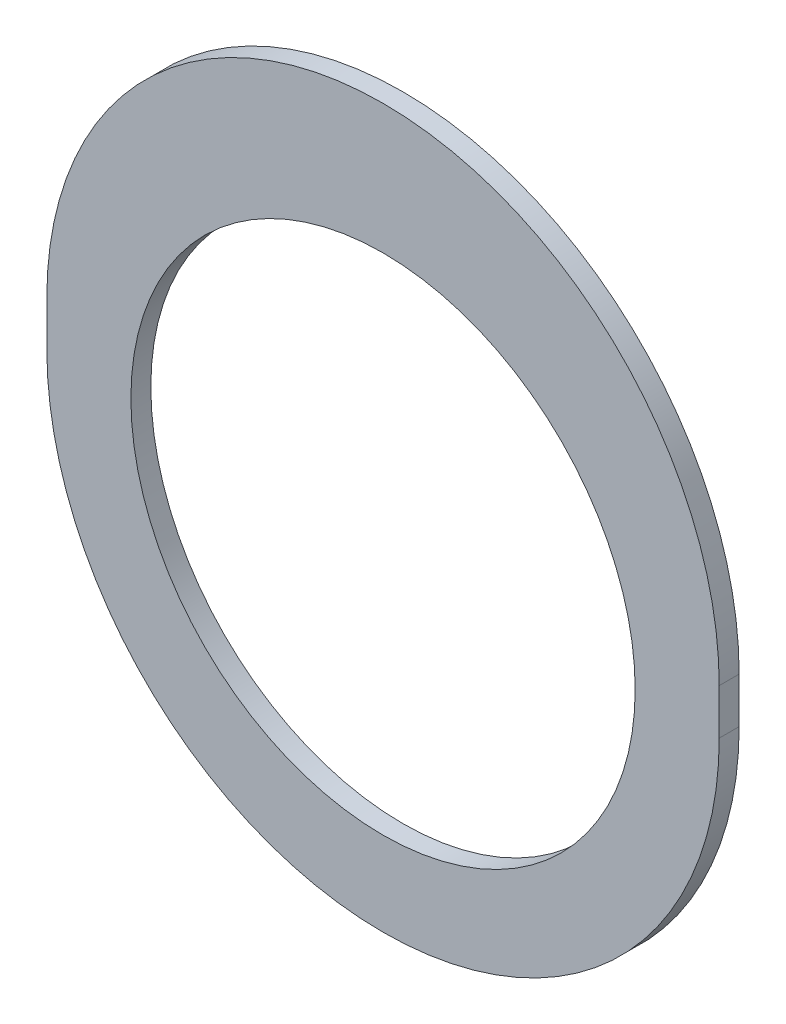
ISO-10303-21;
HEADER;
FILE_DESCRIPTION(('STEP AP214'),'2;1');
FILE_NAME('part.step','',(''),(''),'','','');
FILE_SCHEMA(('AUTOMOTIVE_DESIGN { 1 0 10303 214 1 1 1 1 }'));
ENDSEC;
DATA;
#1=APPLICATION_CONTEXT('core data for automotive mechanical design processes');
#2=APPLICATION_PROTOCOL_DEFINITION('international standard','automotive_design',2000,#1);
#3=PRODUCT_CONTEXT('',#1,'mechanical');
#4=PRODUCT('Part','Part','',(#3));
#5=PRODUCT_RELATED_PRODUCT_CATEGORY('part','',(#4));
#6=PRODUCT_DEFINITION_FORMATION('','',#4);
#7=PRODUCT_DEFINITION_CONTEXT('part definition',#1,'design');
#8=PRODUCT_DEFINITION('design','',#6,#7);
#9=PRODUCT_DEFINITION_SHAPE('','',#8);
#10=(LENGTH_UNIT() NAMED_UNIT(*) SI_UNIT(.MILLI.,.METRE.));
#11=(NAMED_UNIT(*) PLANE_ANGLE_UNIT() SI_UNIT($,.RADIAN.));
#12=(NAMED_UNIT(*) SI_UNIT($,.STERADIAN.) SOLID_ANGLE_UNIT());
#13=UNCERTAINTY_MEASURE_WITH_UNIT(LENGTH_MEASURE(1.E-05),#10,'distance_accuracy_value','');
#14=(GEOMETRIC_REPRESENTATION_CONTEXT(3) GLOBAL_UNCERTAINTY_ASSIGNED_CONTEXT((#13)) GLOBAL_UNIT_ASSIGNED_CONTEXT((#10,
#11,#12)) REPRESENTATION_CONTEXT('',''));
#15=CARTESIAN_POINT('',(0.,0.,0.));
#16=DIRECTION('',(0.,0.,1.));
#17=DIRECTION('',(1.,0.,0.));
#18=AXIS2_PLACEMENT_3D('',#15,#16,#17);
#19=CARTESIAN_POINT('',(94.4310024,117.0280108,0.));
#20=DIRECTION('',(-1.,0.,0.));
#21=DIRECTION('',(0.,1.,0.));
#22=AXIS2_PLACEMENT_3D('',#19,#20,#21);
#23=PLANE('',#22);
#24=DIRECTION('',(0.,1.,0.));
#25=VECTOR('',#24,1.);
#26=CARTESIAN_POINT('',(94.4310024,117.0280108,0.03556));
#27=LINE('',#26,#25);
#28=CARTESIAN_POINT('',(94.4310024,117.0280108,0.03556));
#29=VERTEX_POINT('',#28);
#30=CARTESIAN_POINT('',(94.4310024,117.1091892,0.03556));
#31=VERTEX_POINT('',#30);
#32=EDGE_CURVE('E11',#29,#31,#27,.T.);
#33=ORIENTED_EDGE('',*,*,#32,.F.);
#34=DIRECTION('',(0.,0.,1.));
#35=VECTOR('',#34,1.);
#36=CARTESIAN_POINT('',(94.4310024,117.0280108,0.));
#37=LINE('',#36,#35);
#38=CARTESIAN_POINT('',(94.4310024,117.0280108,0.));
#39=VERTEX_POINT('',#38);
#40=EDGE_CURVE('E24',#39,#29,#37,.T.);
#41=ORIENTED_EDGE('',*,*,#40,.F.);
#42=DIRECTION('',(0.,1.,0.));
#43=VECTOR('',#42,1.);
#44=CARTESIAN_POINT('',(94.4310024,117.0280108,0.));
#45=LINE('',#44,#43);
#46=CARTESIAN_POINT('',(94.4310024,117.1091892,0.));
#47=VERTEX_POINT('',#46);
#48=EDGE_CURVE('E96',#39,#47,#45,.T.);
#49=ORIENTED_EDGE('',*,*,#48,.T.);
#50=DIRECTION('',(0.,0.,1.));
#51=VECTOR('',#50,1.);
#52=CARTESIAN_POINT('',(94.4310024,117.1091892,0.));
#53=LINE('',#52,#51);
#54=EDGE_CURVE('E37',#47,#31,#53,.T.);
#55=ORIENTED_EDGE('',*,*,#54,.T.);
#56=EDGE_LOOP('',(#33,#41,#49,#55));
#57=FACE_BOUND('',#56,.T.);
#58=ADVANCED_FACE('F17',(#57),#23,.F.);
#59=CARTESIAN_POINT('',(93.8310036,117.0280108,0.));
#60=DIRECTION('',(0.,0.,-1.));
#61=DIRECTION('',(-1.,0.,0.));
#62=AXIS2_PLACEMENT_3D('',#59,#60,#61);
#63=CYLINDRICAL_SURFACE('',#62,0.599998799999999);
#64=CARTESIAN_POINT('',(93.8310036,117.0280108,0.03556));
#65=DIRECTION('',(0.,0.,1.));
#66=DIRECTION('',(-1.,0.,0.));
#67=AXIS2_PLACEMENT_3D('',#64,#65,#66);
#68=CIRCLE('',#67,0.599998799999999);
#69=CARTESIAN_POINT('',(93.2310048,117.0280108,0.03556));
#70=VERTEX_POINT('',#69);
#71=EDGE_CURVE('E92',#70,#29,#68,.T.);
#72=ORIENTED_EDGE('',*,*,#71,.F.);
#73=DIRECTION('',(0.,0.,1.));
#74=VECTOR('',#73,1.);
#75=CARTESIAN_POINT('',(93.2310048,117.0280108,0.));
#76=LINE('',#75,#74);
#77=CARTESIAN_POINT('',(93.2310048,117.0280108,0.));
#78=VERTEX_POINT('',#77);
#79=EDGE_CURVE('E90',#78,#70,#76,.T.);
#80=ORIENTED_EDGE('',*,*,#79,.F.);
#81=CARTESIAN_POINT('',(93.8310036,117.0280108,0.));
#82=DIRECTION('',(0.,0.,1.));
#83=DIRECTION('',(-1.,0.,0.));
#84=AXIS2_PLACEMENT_3D('',#81,#82,#83);
#85=CIRCLE('',#84,0.599998799999999);
#86=EDGE_CURVE('E88',#78,#39,#85,.T.);
#87=ORIENTED_EDGE('',*,*,#86,.T.);
#88=ORIENTED_EDGE('',*,*,#40,.T.);
#89=EDGE_LOOP('',(#72,#80,#87,#88));
#90=FACE_BOUND('',#89,.T.);
#91=ADVANCED_FACE('F111',(#90),#63,.T.);
#92=CARTESIAN_POINT('',(93.8310036,117.1091892,0.));
#93=DIRECTION('',(0.,0.,-1.));
#94=DIRECTION('',(1.,0.,0.));
#95=AXIS2_PLACEMENT_3D('',#92,#93,#94);
#96=CYLINDRICAL_SURFACE('',#95,0.599998799999999);
#97=CARTESIAN_POINT('',(93.8310036,117.1091892,0.03556));
#98=DIRECTION('',(0.,0.,1.));
#99=DIRECTION('',(1.,0.,0.));
#100=AXIS2_PLACEMENT_3D('',#97,#98,#99);
#101=CIRCLE('',#100,0.599998799999999);
#102=CARTESIAN_POINT('',(93.2310048,117.1091892,0.03556));
#103=VERTEX_POINT('',#102);
#104=EDGE_CURVE('E85',#31,#103,#101,.T.);
#105=ORIENTED_EDGE('',*,*,#104,.F.);
#106=ORIENTED_EDGE('',*,*,#54,.F.);
#107=CARTESIAN_POINT('',(93.8310036,117.1091892,0.));
#108=DIRECTION('',(0.,0.,1.));
#109=DIRECTION('',(1.,0.,0.));
#110=AXIS2_PLACEMENT_3D('',#107,#108,#109);
#111=CIRCLE('',#110,0.599998799999999);
#112=CARTESIAN_POINT('',(93.2310048,117.1091892,0.));
#113=VERTEX_POINT('',#112);
#114=EDGE_CURVE('E82',#47,#113,#111,.T.);
#115=ORIENTED_EDGE('',*,*,#114,.T.);
#116=DIRECTION('',(0.,0.,1.));
#117=VECTOR('',#116,1.);
#118=CARTESIAN_POINT('',(93.2310048,117.1091892,0.));
#119=LINE('',#118,#117);
#120=EDGE_CURVE('E80',#113,#103,#119,.T.);
#121=ORIENTED_EDGE('',*,*,#120,.T.);
#122=EDGE_LOOP('',(#105,#106,#115,#121));
#123=FACE_BOUND('',#122,.T.);
#124=ADVANCED_FACE('F104',(#123),#96,.T.);
#125=CARTESIAN_POINT('',(93.2310048,117.1091892,0.));
#126=DIRECTION('',(1.,0.,0.));
#127=DIRECTION('',(0.,-1.,0.));
#128=AXIS2_PLACEMENT_3D('',#125,#126,#127);
#129=PLANE('',#128);
#130=DIRECTION('',(0.,-1.,0.));
#131=VECTOR('',#130,1.);
#132=CARTESIAN_POINT('',(93.2310048,117.1091892,0.03556));
#133=LINE('',#132,#131);
#134=EDGE_CURVE('E77',#103,#70,#133,.T.);
#135=ORIENTED_EDGE('',*,*,#134,.F.);
#136=ORIENTED_EDGE('',*,*,#120,.F.);
#137=DIRECTION('',(0.,-1.,0.));
#138=VECTOR('',#137,1.);
#139=CARTESIAN_POINT('',(93.2310048,117.1091892,0.));
#140=LINE('',#139,#138);
#141=EDGE_CURVE('E68',#113,#78,#140,.T.);
#142=ORIENTED_EDGE('',*,*,#141,.T.);
#143=ORIENTED_EDGE('',*,*,#79,.T.);
#144=EDGE_LOOP('',(#135,#136,#142,#143));
#145=FACE_BOUND('',#144,.T.);
#146=ADVANCED_FACE('F110',(#145),#129,.F.);
#147=CARTESIAN_POINT('',(93.8310036,117.0280108,0.));
#148=DIRECTION('',(0.,0.,-1.));
#149=DIRECTION('',(1.,0.,0.));
#150=AXIS2_PLACEMENT_3D('',#147,#148,#149);
#151=CYLINDRICAL_SURFACE('',#150,0.4499991);
#152=DIRECTION('',(0.,0.,1.));
#153=VECTOR('',#152,1.);
#154=CARTESIAN_POINT('',(94.2810027,117.0280108,0.));
#155=LINE('',#154,#153);
#156=CARTESIAN_POINT('',(94.2810027,117.0280108,0.));
#157=VERTEX_POINT('',#156);
#158=CARTESIAN_POINT('',(94.2810027,117.0280108,0.03556));
#159=VERTEX_POINT('',#158);
#160=EDGE_CURVE('E62',#157,#159,#155,.T.);
#161=ORIENTED_EDGE('',*,*,#160,.T.);
#162=CARTESIAN_POINT('',(93.8310036,117.0280108,0.03556));
#163=DIRECTION('',(0.,0.,1.));
#164=DIRECTION('',(1.,0.,0.));
#165=AXIS2_PLACEMENT_3D('',#162,#163,#164);
#166=CIRCLE('',#165,0.4499991);
#167=EDGE_CURVE('E67',#159,#159,#166,.T.);
#168=ORIENTED_EDGE('',*,*,#167,.T.);
#169=ORIENTED_EDGE('',*,*,#160,.F.);
#170=CARTESIAN_POINT('',(93.8310036,117.0280108,0.));
#171=DIRECTION('',(0.,0.,1.));
#172=DIRECTION('',(1.,0.,0.));
#173=AXIS2_PLACEMENT_3D('',#170,#171,#172);
#174=CIRCLE('',#173,0.4499991);
#175=EDGE_CURVE('E65',#157,#157,#174,.T.);
#176=ORIENTED_EDGE('',*,*,#175,.F.);
#177=EDGE_LOOP('',(#161,#168,#169,#176));
#178=FACE_BOUND('',#177,.T.);
#179=ADVANCED_FACE('F64',(#178),#151,.F.);
#180=CARTESIAN_POINT('',(94.4310024,117.0280108,0.));
#181=DIRECTION('',(0.,0.,-1.));
#182=DIRECTION('',(-1.,0.,0.));
#183=AXIS2_PLACEMENT_3D('',#180,#181,#182);
#184=PLANE('',#183);
#185=ORIENTED_EDGE('',*,*,#48,.F.);
#186=ORIENTED_EDGE('',*,*,#86,.F.);
#187=ORIENTED_EDGE('',*,*,#141,.F.);
#188=ORIENTED_EDGE('',*,*,#114,.F.);
#189=EDGE_LOOP('',(#185,#186,#187,#188));
#190=FACE_BOUND('',#189,.T.);
#191=ORIENTED_EDGE('',*,*,#175,.T.);
#192=EDGE_LOOP('',(#191));
#193=FACE_BOUND('',#192,.T.);
#194=ADVANCED_FACE('F71',(#190,#193),#184,.T.);
#195=CARTESIAN_POINT('',(94.4310024,117.0280108,0.03556));
#196=DIRECTION('',(0.,0.,-1.));
#197=DIRECTION('',(-1.,0.,0.));
#198=AXIS2_PLACEMENT_3D('',#195,#196,#197);
#199=PLANE('',#198);
#200=ORIENTED_EDGE('',*,*,#134,.T.);
#201=ORIENTED_EDGE('',*,*,#71,.T.);
#202=ORIENTED_EDGE('',*,*,#32,.T.);
#203=ORIENTED_EDGE('',*,*,#104,.T.);
#204=EDGE_LOOP('',(#200,#201,#202,#203));
#205=FACE_BOUND('',#204,.T.);
#206=ORIENTED_EDGE('',*,*,#167,.F.);
#207=EDGE_LOOP('',(#206));
#208=FACE_BOUND('',#207,.T.);
#209=ADVANCED_FACE('F107',(#205,#208),#199,.F.);
#210=CLOSED_SHELL('',(#58,#91,#124,#146,#179,#194,#209));
#211=MANIFOLD_SOLID_BREP('B1',#210);
#212=ADVANCED_BREP_SHAPE_REPRESENTATION('',(#18,#211),#14);
#213=SHAPE_DEFINITION_REPRESENTATION(#9,#212);
ENDSEC;
END-ISO-10303-21;
